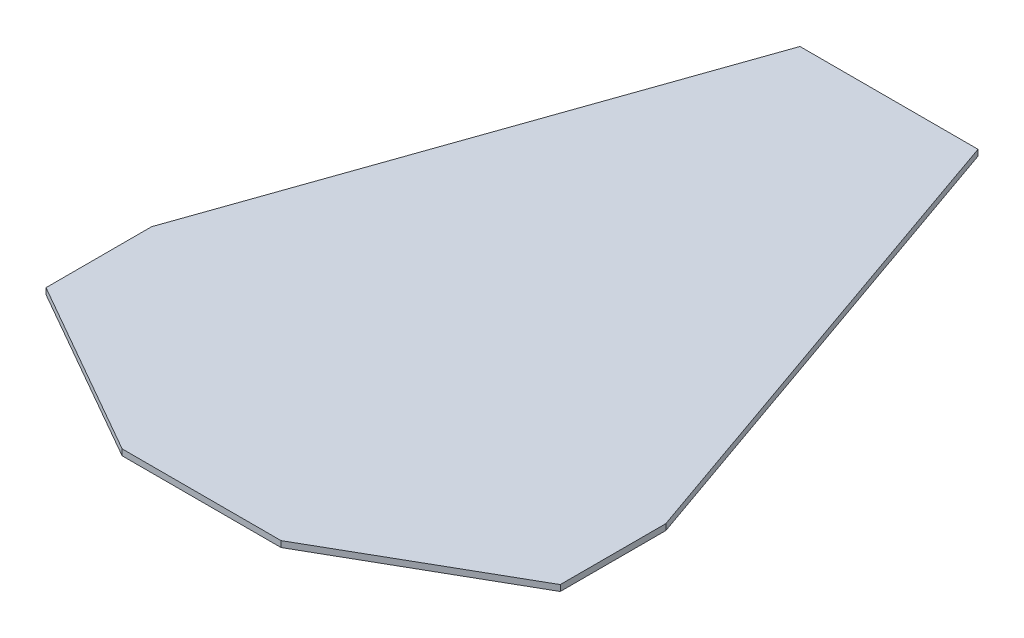
ISO-10303-21;
HEADER;
FILE_DESCRIPTION(('STEP AP214'),'2;1');
FILE_NAME('part.step','',(''),(''),'','','');
FILE_SCHEMA(('AUTOMOTIVE_DESIGN { 1 0 10303 214 1 1 1 1 }'));
ENDSEC;
DATA;
#1=APPLICATION_CONTEXT('core data for automotive mechanical design processes');
#2=APPLICATION_PROTOCOL_DEFINITION('international standard','automotive_design',2000,#1);
#3=PRODUCT_CONTEXT('',#1,'mechanical');
#4=PRODUCT('Part','Part','',(#3));
#5=PRODUCT_RELATED_PRODUCT_CATEGORY('part','',(#4));
#6=PRODUCT_DEFINITION_FORMATION('','',#4);
#7=PRODUCT_DEFINITION_CONTEXT('part definition',#1,'design');
#8=PRODUCT_DEFINITION('design','',#6,#7);
#9=PRODUCT_DEFINITION_SHAPE('','',#8);
#10=(LENGTH_UNIT() NAMED_UNIT(*) SI_UNIT(.MILLI.,.METRE.));
#11=(NAMED_UNIT(*) PLANE_ANGLE_UNIT() SI_UNIT($,.RADIAN.));
#12=(NAMED_UNIT(*) SI_UNIT($,.STERADIAN.) SOLID_ANGLE_UNIT());
#13=UNCERTAINTY_MEASURE_WITH_UNIT(LENGTH_MEASURE(1.E-05),#10,'distance_accuracy_value','');
#14=(GEOMETRIC_REPRESENTATION_CONTEXT(3) GLOBAL_UNCERTAINTY_ASSIGNED_CONTEXT((#13)) GLOBAL_UNIT_ASSIGNED_CONTEXT((#10,
#11,#12)) REPRESENTATION_CONTEXT('',''));
#15=CARTESIAN_POINT('',(0.,0.,0.));
#16=DIRECTION('',(0.,0.,1.));
#17=DIRECTION('',(1.,0.,0.));
#18=AXIS2_PLACEMENT_3D('',#15,#16,#17);
#19=CARTESIAN_POINT('',(0.,3.175,-355.6));
#20=DIRECTION('',(0.,0.,-1.));
#21=DIRECTION('',(-1.,0.,0.));
#22=AXIS2_PLACEMENT_3D('',#19,#20,#21);
#23=PLANE('',#22);
#24=DIRECTION('',(1.,0.,0.));
#25=VECTOR('',#24,1.);
#26=CARTESIAN_POINT('',(0.,0.,-355.6));
#27=LINE('',#26,#25);
#28=CARTESIAN_POINT('',(-6.72770438188246,0.,-355.6));
#29=VERTEX_POINT('',#28);
#30=CARTESIAN_POINT('',(87.0228177943824,0.,-355.6));
#31=VERTEX_POINT('',#30);
#32=EDGE_CURVE('E128',#29,#31,#27,.T.);
#33=ORIENTED_EDGE('',*,*,#32,.F.);
#34=DIRECTION('',(0.,-1.,0.));
#35=VECTOR('',#34,1.);
#36=CARTESIAN_POINT('',(-6.72770438188246,3.175,-355.6));
#37=LINE('',#36,#35);
#38=CARTESIAN_POINT('',(-6.72770438188246,3.175,-355.6));
#39=VERTEX_POINT('',#38);
#40=EDGE_CURVE('E11',#39,#29,#37,.T.);
#41=ORIENTED_EDGE('',*,*,#40,.F.);
#42=DIRECTION('',(1.,0.,0.));
#43=VECTOR('',#42,1.);
#44=CARTESIAN_POINT('',(0.,3.175,-355.6));
#45=LINE('',#44,#43);
#46=CARTESIAN_POINT('',(87.0228177943824,3.175,-355.6));
#47=VERTEX_POINT('',#46);
#48=EDGE_CURVE('E145',#39,#47,#45,.T.);
#49=ORIENTED_EDGE('',*,*,#48,.T.);
#50=DIRECTION('',(0.,-1.,0.));
#51=VECTOR('',#50,1.);
#52=CARTESIAN_POINT('',(87.0228177943824,3.175,-355.6));
#53=LINE('',#52,#51);
#54=EDGE_CURVE('E51',#47,#31,#53,.T.);
#55=ORIENTED_EDGE('',*,*,#54,.T.);
#56=EDGE_LOOP('',(#33,#41,#49,#55));
#57=FACE_BOUND('',#56,.T.);
#58=ADVANCED_FACE('F35',(#57),#23,.T.);
#59=CARTESIAN_POINT('',(-116.871006130853,3.175,-40.9048521457985));
#60=DIRECTION('',(0.943858356366017,0.,0.330350424728106));
#61=DIRECTION('',(0.330350424728106,0.,-0.943858356366018));
#62=AXIS2_PLACEMENT_3D('',#59,#60,#61);
#63=PLANE('',#62);
#64=DIRECTION('',(-0.330350424728106,0.,0.943858356366018));
#65=VECTOR('',#64,1.);
#66=CARTESIAN_POINT('',(-116.871006130853,0.,-40.9048521457985));
#67=LINE('',#66,#65);
#68=CARTESIAN_POINT('',(-95.25,0.,-102.679155376807));
#69=VERTEX_POINT('',#68);
#70=EDGE_CURVE('E130',#29,#69,#67,.T.);
#71=ORIENTED_EDGE('',*,*,#70,.T.);
#72=DIRECTION('',(0.,-1.,0.));
#73=VECTOR('',#72,1.);
#74=CARTESIAN_POINT('',(-95.25,3.175,-102.679155376807));
#75=LINE('',#74,#73);
#76=CARTESIAN_POINT('',(-95.25,3.175,-102.679155376807));
#77=VERTEX_POINT('',#76);
#78=EDGE_CURVE('E43',#77,#69,#75,.T.);
#79=ORIENTED_EDGE('',*,*,#78,.F.);
#80=DIRECTION('',(-0.330350424728106,0.,0.943858356366018));
#81=VECTOR('',#80,1.);
#82=CARTESIAN_POINT('',(-116.871006130853,3.175,-40.9048521457985));
#83=LINE('',#82,#81);
#84=EDGE_CURVE('E178',#39,#77,#83,.T.);
#85=ORIENTED_EDGE('',*,*,#84,.F.);
#86=ORIENTED_EDGE('',*,*,#40,.T.);
#87=EDGE_LOOP('',(#71,#79,#85,#86));
#88=FACE_BOUND('',#87,.T.);
#89=ADVANCED_FACE('F191',(#88),#63,.F.);
#90=CARTESIAN_POINT('',(-95.25,3.175,0.));
#91=DIRECTION('',(1.,0.,0.));
#92=DIRECTION('',(0.,0.,-1.));
#93=AXIS2_PLACEMENT_3D('',#90,#91,#92);
#94=PLANE('',#93);
#95=DIRECTION('',(0.,0.,1.));
#96=VECTOR('',#95,1.);
#97=CARTESIAN_POINT('',(-95.25,0.,0.));
#98=LINE('',#97,#96);
#99=CARTESIAN_POINT('',(-95.25,0.,-47.1149518997577));
#100=VERTEX_POINT('',#99);
#101=EDGE_CURVE('E132',#69,#100,#98,.T.);
#102=ORIENTED_EDGE('',*,*,#101,.T.);
#103=DIRECTION('',(0.,-1.,0.));
#104=VECTOR('',#103,1.);
#105=CARTESIAN_POINT('',(-95.25,3.175,-47.1149518997577));
#106=LINE('',#105,#104);
#107=CARTESIAN_POINT('',(-95.25,3.175,-47.1149518997577));
#108=VERTEX_POINT('',#107);
#109=EDGE_CURVE('E152',#108,#100,#106,.T.);
#110=ORIENTED_EDGE('',*,*,#109,.F.);
#111=DIRECTION('',(0.,0.,1.));
#112=VECTOR('',#111,1.);
#113=CARTESIAN_POINT('',(-95.25,3.175,0.));
#114=LINE('',#113,#112);
#115=EDGE_CURVE('E161',#77,#108,#114,.T.);
#116=ORIENTED_EDGE('',*,*,#115,.F.);
#117=ORIENTED_EDGE('',*,*,#78,.T.);
#118=EDGE_LOOP('',(#102,#110,#116,#117));
#119=FACE_BOUND('',#118,.T.);
#120=ADVANCED_FACE('F159',(#119),#94,.F.);
#121=CARTESIAN_POINT('',(-3.1504822585659,3.175,5.51334395249032));
#122=DIRECTION('',(0.496138938356834,0.,-0.868243142124459));
#123=DIRECTION('',(-0.868243142124459,0.,-0.496138938356834));
#124=AXIS2_PLACEMENT_3D('',#121,#122,#123);
#125=PLANE('',#124);
#126=DIRECTION('',(0.868243142124459,0.,0.496138938356834));
#127=VECTOR('',#126,1.);
#128=CARTESIAN_POINT('',(-3.1504822585659,0.,5.51334395249032));
#129=LINE('',#128,#127);
#130=CARTESIAN_POINT('',(-1.68633417542396,0.,6.35));
#131=VERTEX_POINT('',#130);
#132=EDGE_CURVE('E134',#100,#131,#129,.T.);
#133=ORIENTED_EDGE('',*,*,#132,.T.);
#134=DIRECTION('',(0.,-1.,0.));
#135=VECTOR('',#134,1.);
#136=CARTESIAN_POINT('',(-1.68633417542396,3.175,6.35));
#137=LINE('',#136,#135);
#138=CARTESIAN_POINT('',(-1.68633417542396,3.175,6.35));
#139=VERTEX_POINT('',#138);
#140=EDGE_CURVE('E149',#139,#131,#137,.T.);
#141=ORIENTED_EDGE('',*,*,#140,.F.);
#142=DIRECTION('',(0.868243142124459,0.,0.496138938356834));
#143=VECTOR('',#142,1.);
#144=CARTESIAN_POINT('',(-3.1504822585659,3.175,5.51334395249032));
#145=LINE('',#144,#143);
#146=EDGE_CURVE('E174',#108,#139,#145,.T.);
#147=ORIENTED_EDGE('',*,*,#146,.F.);
#148=ORIENTED_EDGE('',*,*,#109,.T.);
#149=EDGE_LOOP('',(#133,#141,#147,#148));
#150=FACE_BOUND('',#149,.T.);
#151=ADVANCED_FACE('F170',(#150),#125,.F.);
#152=CARTESIAN_POINT('',(0.,3.175,6.35));
#153=DIRECTION('',(0.,0.,-1.));
#154=DIRECTION('',(-1.,0.,0.));
#155=AXIS2_PLACEMENT_3D('',#152,#153,#154);
#156=PLANE('',#155);
#157=DIRECTION('',(1.,0.,0.));
#158=VECTOR('',#157,1.);
#159=CARTESIAN_POINT('',(0.,0.,6.35));
#160=LINE('',#159,#158);
#161=CARTESIAN_POINT('',(81.9814475879239,0.,6.35));
#162=VERTEX_POINT('',#161);
#163=EDGE_CURVE('E136',#131,#162,#160,.T.);
#164=ORIENTED_EDGE('',*,*,#163,.T.);
#165=DIRECTION('',(0.,-1.,0.));
#166=VECTOR('',#165,1.);
#167=CARTESIAN_POINT('',(81.9814475879239,3.175,6.35));
#168=LINE('',#167,#166);
#169=CARTESIAN_POINT('',(81.9814475879239,3.175,6.35));
#170=VERTEX_POINT('',#169);
#171=EDGE_CURVE('E110',#170,#162,#168,.T.);
#172=ORIENTED_EDGE('',*,*,#171,.F.);
#173=DIRECTION('',(1.,0.,0.));
#174=VECTOR('',#173,1.);
#175=CARTESIAN_POINT('',(0.,3.175,6.35));
#176=LINE('',#175,#174);
#177=EDGE_CURVE('E119',#139,#170,#176,.T.);
#178=ORIENTED_EDGE('',*,*,#177,.F.);
#179=ORIENTED_EDGE('',*,*,#140,.T.);
#180=EDGE_LOOP('',(#164,#172,#178,#179));
#181=FACE_BOUND('',#180,.T.);
#182=ADVANCED_FACE('F173',(#181),#156,.F.);
#183=CARTESIAN_POINT('',(22.9154332524121,3.175,40.1020081917211));
#184=DIRECTION('',(0.496138938356834,0.,0.868243142124459));
#185=DIRECTION('',(0.868243142124459,0.,-0.496138938356834));
#186=AXIS2_PLACEMENT_3D('',#183,#184,#185);
#187=PLANE('',#186);
#188=DIRECTION('',(-0.868243142124459,0.,0.496138938356834));
#189=VECTOR('',#188,1.);
#190=CARTESIAN_POINT('',(22.9154332524121,0.,40.1020081917211));
#191=LINE('',#190,#189);
#192=CARTESIAN_POINT('',(175.5451134125,0.,-47.1149518997577));
#193=VERTEX_POINT('',#192);
#194=EDGE_CURVE('E106',#193,#162,#191,.T.);
#195=ORIENTED_EDGE('',*,*,#194,.F.);
#196=DIRECTION('',(0.,-1.,0.));
#197=VECTOR('',#196,1.);
#198=CARTESIAN_POINT('',(175.5451134125,3.175,-47.1149518997577));
#199=LINE('',#198,#197);
#200=CARTESIAN_POINT('',(175.5451134125,3.175,-47.1149518997577));
#201=VERTEX_POINT('',#200);
#202=EDGE_CURVE('E101',#201,#193,#199,.T.);
#203=ORIENTED_EDGE('',*,*,#202,.F.);
#204=DIRECTION('',(-0.868243142124459,0.,0.496138938356834));
#205=VECTOR('',#204,1.);
#206=CARTESIAN_POINT('',(22.9154332524121,3.175,40.1020081917211));
#207=LINE('',#206,#205);
#208=EDGE_CURVE('E104',#201,#170,#207,.T.);
#209=ORIENTED_EDGE('',*,*,#208,.T.);
#210=ORIENTED_EDGE('',*,*,#171,.T.);
#211=EDGE_LOOP('',(#195,#203,#209,#210));
#212=FACE_BOUND('',#211,.T.);
#213=ADVANCED_FACE('F103',(#212),#187,.T.);
#214=CARTESIAN_POINT('',(175.5451134125,3.175,0.));
#215=DIRECTION('',(1.,0.,0.));
#216=DIRECTION('',(0.,0.,-1.));
#217=AXIS2_PLACEMENT_3D('',#214,#215,#216);
#218=PLANE('',#217);
#219=DIRECTION('',(0.,0.,1.));
#220=VECTOR('',#219,1.);
#221=CARTESIAN_POINT('',(175.5451134125,0.,0.));
#222=LINE('',#221,#220);
#223=CARTESIAN_POINT('',(175.5451134125,0.,-102.679155376807));
#224=VERTEX_POINT('',#223);
#225=EDGE_CURVE('E140',#224,#193,#222,.T.);
#226=ORIENTED_EDGE('',*,*,#225,.F.);
#227=DIRECTION('',(0.,-1.,0.));
#228=VECTOR('',#227,1.);
#229=CARTESIAN_POINT('',(175.5451134125,3.175,-102.679155376807));
#230=LINE('',#229,#228);
#231=CARTESIAN_POINT('',(175.5451134125,3.175,-102.679155376807));
#232=VERTEX_POINT('',#231);
#233=EDGE_CURVE('E76',#232,#224,#230,.T.);
#234=ORIENTED_EDGE('',*,*,#233,.F.);
#235=DIRECTION('',(0.,0.,1.));
#236=VECTOR('',#235,1.);
#237=CARTESIAN_POINT('',(175.5451134125,3.175,0.));
#238=LINE('',#237,#236);
#239=EDGE_CURVE('E117',#232,#201,#238,.T.);
#240=ORIENTED_EDGE('',*,*,#239,.T.);
#241=ORIENTED_EDGE('',*,*,#202,.T.);
#242=EDGE_LOOP('',(#226,#234,#240,#241));
#243=FACE_BOUND('',#242,.T.);
#244=ADVANCED_FACE('F122',(#243),#218,.T.);
#245=CARTESIAN_POINT('',(188.403401153125,3.175,-65.9411904035936));
#246=DIRECTION('',(0.943858356366017,0.,-0.330350424728106));
#247=DIRECTION('',(-0.330350424728106,0.,-0.943858356366018));
#248=AXIS2_PLACEMENT_3D('',#245,#246,#247);
#249=PLANE('',#248);
#250=DIRECTION('',(0.330350424728106,0.,0.943858356366018));
#251=VECTOR('',#250,1.);
#252=CARTESIAN_POINT('',(188.403401153125,0.,-65.9411904035936));
#253=LINE('',#252,#251);
#254=EDGE_CURVE('E142',#31,#224,#253,.T.);
#255=ORIENTED_EDGE('',*,*,#254,.F.);
#256=ORIENTED_EDGE('',*,*,#54,.F.);
#257=DIRECTION('',(0.330350424728106,0.,0.943858356366018));
#258=VECTOR('',#257,1.);
#259=CARTESIAN_POINT('',(188.403401153125,3.175,-65.9411904035936));
#260=LINE('',#259,#258);
#261=EDGE_CURVE('E123',#47,#232,#260,.T.);
#262=ORIENTED_EDGE('',*,*,#261,.T.);
#263=ORIENTED_EDGE('',*,*,#233,.T.);
#264=EDGE_LOOP('',(#255,#256,#262,#263));
#265=FACE_BOUND('',#264,.T.);
#266=ADVANCED_FACE('F180',(#265),#249,.T.);
#267=CARTESIAN_POINT('',(0.,3.175,0.));
#268=DIRECTION('',(0.,1.,0.));
#269=DIRECTION('',(0.,0.,1.));
#270=AXIS2_PLACEMENT_3D('',#267,#268,#269);
#271=PLANE('',#270);
#272=ORIENTED_EDGE('',*,*,#48,.F.);
#273=ORIENTED_EDGE('',*,*,#84,.T.);
#274=ORIENTED_EDGE('',*,*,#115,.T.);
#275=ORIENTED_EDGE('',*,*,#146,.T.);
#276=ORIENTED_EDGE('',*,*,#177,.T.);
#277=ORIENTED_EDGE('',*,*,#208,.F.);
#278=ORIENTED_EDGE('',*,*,#239,.F.);
#279=ORIENTED_EDGE('',*,*,#261,.F.);
#280=EDGE_LOOP('',(#272,#273,#274,#275,#276,#277,#278,#279));
#281=FACE_BOUND('',#280,.T.);
#282=ADVANCED_FACE('F115',(#281),#271,.T.);
#283=CARTESIAN_POINT('',(0.,0.,0.));
#284=DIRECTION('',(0.,1.,0.));
#285=DIRECTION('',(0.,0.,1.));
#286=AXIS2_PLACEMENT_3D('',#283,#284,#285);
#287=PLANE('',#286);
#288=ORIENTED_EDGE('',*,*,#32,.T.);
#289=ORIENTED_EDGE('',*,*,#254,.T.);
#290=ORIENTED_EDGE('',*,*,#225,.T.);
#291=ORIENTED_EDGE('',*,*,#194,.T.);
#292=ORIENTED_EDGE('',*,*,#163,.F.);
#293=ORIENTED_EDGE('',*,*,#132,.F.);
#294=ORIENTED_EDGE('',*,*,#101,.F.);
#295=ORIENTED_EDGE('',*,*,#70,.F.);
#296=EDGE_LOOP('',(#288,#289,#290,#291,#292,#293,#294,#295));
#297=FACE_BOUND('',#296,.T.);
#298=ADVANCED_FACE('F166',(#297),#287,.F.);
#299=CLOSED_SHELL('',(#58,#89,#120,#151,#182,#213,#244,#266,#282,#298));
#300=MANIFOLD_SOLID_BREP('B2',#299);
#301=ADVANCED_BREP_SHAPE_REPRESENTATION('',(#18,#300),#14);
#302=SHAPE_DEFINITION_REPRESENTATION(#9,#301);
ENDSEC;
END-ISO-10303-21;
